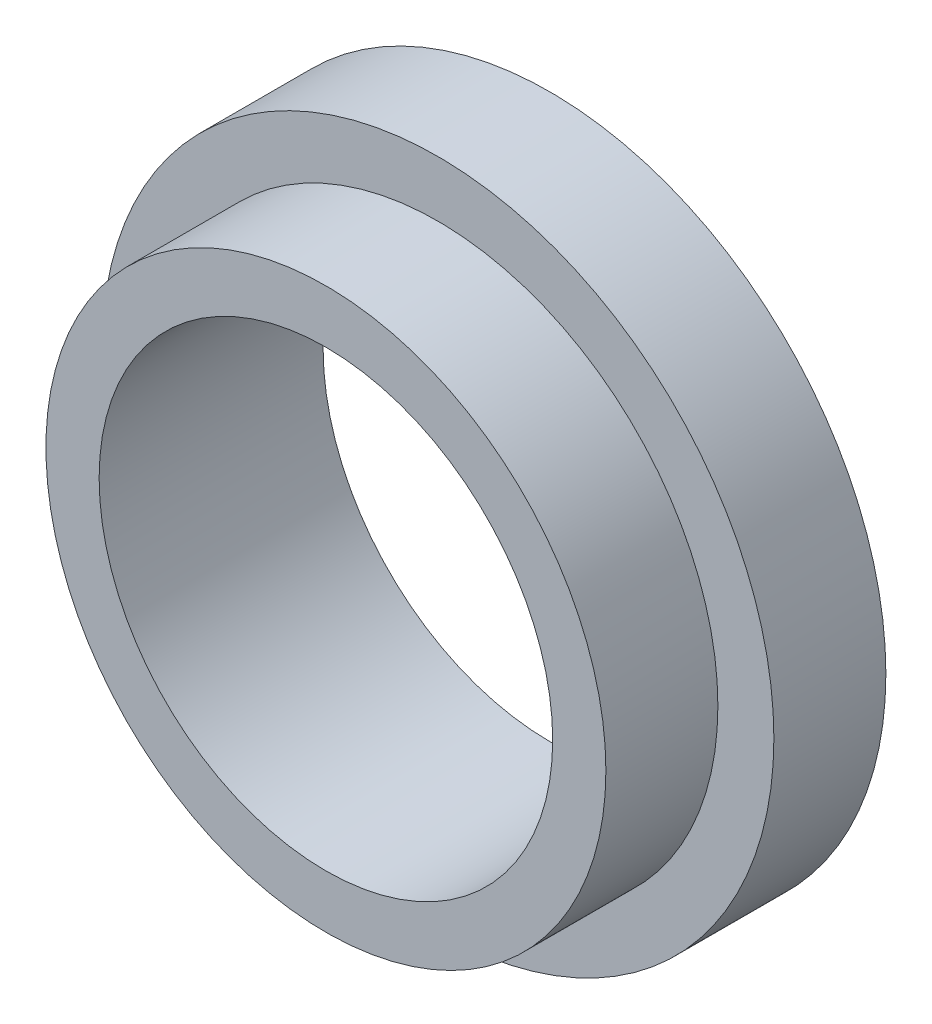
ISO-10303-21;
HEADER;
FILE_DESCRIPTION(('STEP AP214'),'2;1');
FILE_NAME('part.step','',(''),(''),'','','');
FILE_SCHEMA(('AUTOMOTIVE_DESIGN { 1 0 10303 214 1 1 1 1 }'));
ENDSEC;
DATA;
#1=APPLICATION_CONTEXT('core data for automotive mechanical design processes');
#2=APPLICATION_PROTOCOL_DEFINITION('international standard','automotive_design',2000,#1);
#3=PRODUCT_CONTEXT('',#1,'mechanical');
#4=PRODUCT('Part','Part','',(#3));
#5=PRODUCT_RELATED_PRODUCT_CATEGORY('part','',(#4));
#6=PRODUCT_DEFINITION_FORMATION('','',#4);
#7=PRODUCT_DEFINITION_CONTEXT('part definition',#1,'design');
#8=PRODUCT_DEFINITION('design','',#6,#7);
#9=PRODUCT_DEFINITION_SHAPE('','',#8);
#10=(LENGTH_UNIT() NAMED_UNIT(*) SI_UNIT(.MILLI.,.METRE.));
#11=(NAMED_UNIT(*) PLANE_ANGLE_UNIT() SI_UNIT($,.RADIAN.));
#12=(NAMED_UNIT(*) SI_UNIT($,.STERADIAN.) SOLID_ANGLE_UNIT());
#13=UNCERTAINTY_MEASURE_WITH_UNIT(LENGTH_MEASURE(1.E-05),#10,'distance_accuracy_value','');
#14=(GEOMETRIC_REPRESENTATION_CONTEXT(3) GLOBAL_UNCERTAINTY_ASSIGNED_CONTEXT((#13)) GLOBAL_UNIT_ASSIGNED_CONTEXT((#10,
#11,#12)) REPRESENTATION_CONTEXT('',''));
#15=CARTESIAN_POINT('',(0.,0.,0.));
#16=DIRECTION('',(0.,0.,1.));
#17=DIRECTION('',(1.,0.,0.));
#18=AXIS2_PLACEMENT_3D('',#15,#16,#17);
#19=CARTESIAN_POINT('',(0.,5.,0.));
#20=DIRECTION('',(0.,0.,-1.));
#21=DIRECTION('',(-1.,0.,0.));
#22=AXIS2_PLACEMENT_3D('',#19,#20,#21);
#23=PLANE('',#22);
#24=CARTESIAN_POINT('',(0.,0.,0.));
#25=DIRECTION('',(0.,0.,1.));
#26=DIRECTION('',(1.,0.,0.));
#27=AXIS2_PLACEMENT_3D('',#24,#25,#26);
#28=CIRCLE('',#27,4.05);
#29=CARTESIAN_POINT('',(4.05,0.,0.));
#30=VERTEX_POINT('',#29);
#31=EDGE_CURVE('E10',#30,#30,#28,.T.);
#32=ORIENTED_EDGE('',*,*,#31,.F.);
#33=EDGE_LOOP('',(#32));
#34=FACE_BOUND('',#33,.T.);
#35=CARTESIAN_POINT('',(0.,0.,0.));
#36=DIRECTION('',(0.,0.,1.));
#37=DIRECTION('',(1.,0.,0.));
#38=AXIS2_PLACEMENT_3D('',#35,#36,#37);
#39=CIRCLE('',#38,5.);
#40=CARTESIAN_POINT('',(5.,0.,0.));
#41=VERTEX_POINT('',#40);
#42=EDGE_CURVE('E62',#41,#41,#39,.T.);
#43=ORIENTED_EDGE('',*,*,#42,.T.);
#44=EDGE_LOOP('',(#43));
#45=FACE_BOUND('',#44,.T.);
#46=ADVANCED_FACE('F34',(#34,#45),#23,.F.);
#47=CARTESIAN_POINT('',(0.,0.,0.));
#48=DIRECTION('',(0.,0.,1.));
#49=DIRECTION('',(1.,0.,0.));
#50=AXIS2_PLACEMENT_3D('',#47,#48,#49);
#51=CYLINDRICAL_SURFACE('',#50,4.05);
#52=CARTESIAN_POINT('',(0.,0.,-4.));
#53=DIRECTION('',(0.,0.,1.));
#54=DIRECTION('',(1.,0.,0.));
#55=AXIS2_PLACEMENT_3D('',#52,#53,#54);
#56=CIRCLE('',#55,4.05);
#57=CARTESIAN_POINT('',(4.05,0.,-4.));
#58=VERTEX_POINT('',#57);
#59=EDGE_CURVE('E41',#58,#58,#56,.T.);
#60=ORIENTED_EDGE('',*,*,#59,.F.);
#61=EDGE_LOOP('',(#60));
#62=FACE_BOUND('',#61,.T.);
#63=ORIENTED_EDGE('',*,*,#31,.T.);
#64=EDGE_LOOP('',(#63));
#65=FACE_BOUND('',#64,.T.);
#66=ADVANCED_FACE('F87',(#62,#65),#51,.F.);
#67=CARTESIAN_POINT('',(0.,4.05,-4.));
#68=DIRECTION('',(0.,0.,1.));
#69=DIRECTION('',(1.,0.,0.));
#70=AXIS2_PLACEMENT_3D('',#67,#68,#69);
#71=PLANE('',#70);
#72=CARTESIAN_POINT('',(0.,0.,-4.));
#73=DIRECTION('',(0.,0.,1.));
#74=DIRECTION('',(1.,0.,0.));
#75=AXIS2_PLACEMENT_3D('',#72,#73,#74);
#76=CIRCLE('',#75,6.);
#77=CARTESIAN_POINT('',(6.,0.,-4.));
#78=VERTEX_POINT('',#77);
#79=EDGE_CURVE('E47',#78,#78,#76,.T.);
#80=ORIENTED_EDGE('',*,*,#79,.F.);
#81=EDGE_LOOP('',(#80));
#82=FACE_BOUND('',#81,.T.);
#83=ORIENTED_EDGE('',*,*,#59,.T.);
#84=EDGE_LOOP('',(#83));
#85=FACE_BOUND('',#84,.T.);
#86=ADVANCED_FACE('F82',(#82,#85),#71,.F.);
#87=CARTESIAN_POINT('',(0.,0.,0.));
#88=DIRECTION('',(0.,0.,1.));
#89=DIRECTION('',(1.,0.,0.));
#90=AXIS2_PLACEMENT_3D('',#87,#88,#89);
#91=CYLINDRICAL_SURFACE('',#90,6.);
#92=CARTESIAN_POINT('',(0.,0.,-2.));
#93=DIRECTION('',(0.,0.,1.));
#94=DIRECTION('',(1.,0.,0.));
#95=AXIS2_PLACEMENT_3D('',#92,#93,#94);
#96=CIRCLE('',#95,6.);
#97=CARTESIAN_POINT('',(6.,0.,-2.));
#98=VERTEX_POINT('',#97);
#99=EDGE_CURVE('E53',#98,#98,#96,.T.);
#100=ORIENTED_EDGE('',*,*,#99,.F.);
#101=EDGE_LOOP('',(#100));
#102=FACE_BOUND('',#101,.T.);
#103=ORIENTED_EDGE('',*,*,#79,.T.);
#104=EDGE_LOOP('',(#103));
#105=FACE_BOUND('',#104,.T.);
#106=ADVANCED_FACE('F76',(#102,#105),#91,.T.);
#107=CARTESIAN_POINT('',(0.,6.,-2.));
#108=DIRECTION('',(0.,0.,-1.));
#109=DIRECTION('',(-1.,0.,0.));
#110=AXIS2_PLACEMENT_3D('',#107,#108,#109);
#111=PLANE('',#110);
#112=CARTESIAN_POINT('',(0.,0.,-2.));
#113=DIRECTION('',(0.,0.,1.));
#114=DIRECTION('',(1.,0.,0.));
#115=AXIS2_PLACEMENT_3D('',#112,#113,#114);
#116=CIRCLE('',#115,5.);
#117=CARTESIAN_POINT('',(5.,0.,-2.));
#118=VERTEX_POINT('',#117);
#119=EDGE_CURVE('E59',#118,#118,#116,.T.);
#120=ORIENTED_EDGE('',*,*,#119,.F.);
#121=EDGE_LOOP('',(#120));
#122=FACE_BOUND('',#121,.T.);
#123=ORIENTED_EDGE('',*,*,#99,.T.);
#124=EDGE_LOOP('',(#123));
#125=FACE_BOUND('',#124,.T.);
#126=ADVANCED_FACE('F70',(#122,#125),#111,.F.);
#127=CARTESIAN_POINT('',(0.,0.,0.));
#128=DIRECTION('',(0.,0.,1.));
#129=DIRECTION('',(1.,0.,0.));
#130=AXIS2_PLACEMENT_3D('',#127,#128,#129);
#131=CYLINDRICAL_SURFACE('',#130,5.);
#132=ORIENTED_EDGE('',*,*,#42,.F.);
#133=EDGE_LOOP('',(#132));
#134=FACE_BOUND('',#133,.T.);
#135=ORIENTED_EDGE('',*,*,#119,.T.);
#136=EDGE_LOOP('',(#135));
#137=FACE_BOUND('',#136,.T.);
#138=ADVANCED_FACE('F67',(#134,#137),#131,.T.);
#139=CLOSED_SHELL('',(#46,#66,#86,#106,#126,#138));
#140=MANIFOLD_SOLID_BREP('B2',#139);
#141=ADVANCED_BREP_SHAPE_REPRESENTATION('',(#18,#140),#14);
#142=SHAPE_DEFINITION_REPRESENTATION(#9,#141);
ENDSEC;
END-ISO-10303-21;
